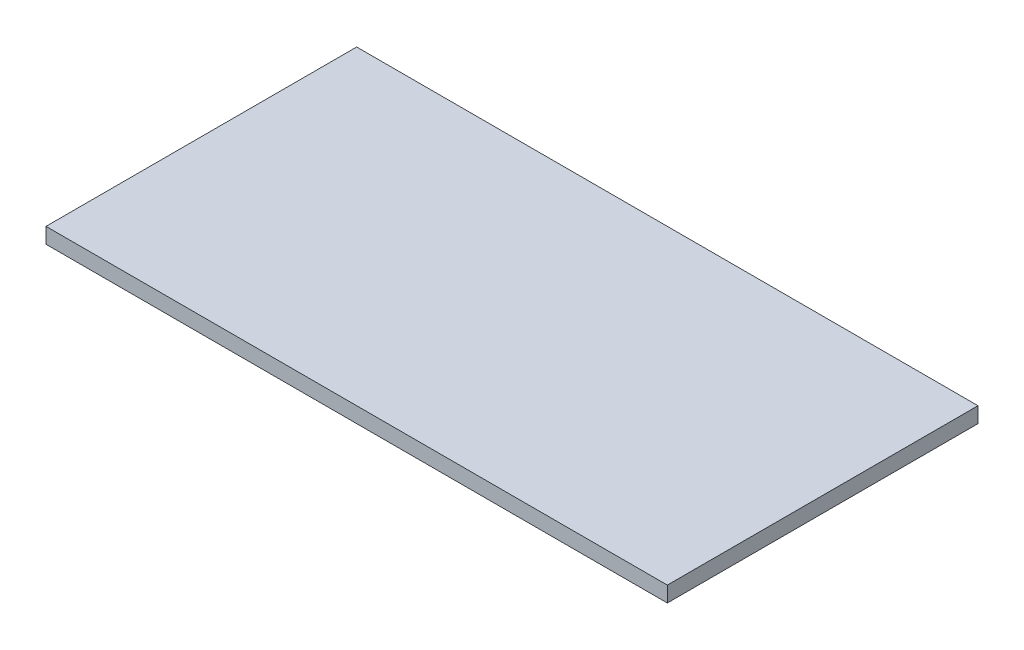
ISO-10303-21;
HEADER;
FILE_DESCRIPTION(('STEP AP214'),'2;1');
FILE_NAME('part.step','',(''),(''),'','','');
FILE_SCHEMA(('AUTOMOTIVE_DESIGN { 1 0 10303 214 1 1 1 1 }'));
ENDSEC;
DATA;
#1=APPLICATION_CONTEXT('core data for automotive mechanical design processes');
#2=APPLICATION_PROTOCOL_DEFINITION('international standard','automotive_design',2000,#1);
#3=PRODUCT_CONTEXT('',#1,'mechanical');
#4=PRODUCT('Part','Part','',(#3));
#5=PRODUCT_RELATED_PRODUCT_CATEGORY('part','',(#4));
#6=PRODUCT_DEFINITION_FORMATION('','',#4);
#7=PRODUCT_DEFINITION_CONTEXT('part definition',#1,'design');
#8=PRODUCT_DEFINITION('design','',#6,#7);
#9=PRODUCT_DEFINITION_SHAPE('','',#8);
#10=(LENGTH_UNIT() NAMED_UNIT(*) SI_UNIT(.MILLI.,.METRE.));
#11=(NAMED_UNIT(*) PLANE_ANGLE_UNIT() SI_UNIT($,.RADIAN.));
#12=(NAMED_UNIT(*) SI_UNIT($,.STERADIAN.) SOLID_ANGLE_UNIT());
#13=UNCERTAINTY_MEASURE_WITH_UNIT(LENGTH_MEASURE(1.E-05),#10,'distance_accuracy_value','');
#14=(GEOMETRIC_REPRESENTATION_CONTEXT(3) GLOBAL_UNCERTAINTY_ASSIGNED_CONTEXT((#13)) GLOBAL_UNIT_ASSIGNED_CONTEXT((#10,
#11,#12)) REPRESENTATION_CONTEXT('',''));
#15=CARTESIAN_POINT('',(0.,0.,0.));
#16=DIRECTION('',(0.,0.,1.));
#17=DIRECTION('',(1.,0.,0.));
#18=AXIS2_PLACEMENT_3D('',#15,#16,#17);
#19=CARTESIAN_POINT('',(0.,25.4,0.));
#20=DIRECTION('',(1.,0.,0.));
#21=DIRECTION('',(0.,0.,-1.));
#22=AXIS2_PLACEMENT_3D('',#19,#20,#21);
#23=PLANE('',#22);
#24=DIRECTION('',(0.,0.,1.));
#25=VECTOR('',#24,1.);
#26=CARTESIAN_POINT('',(0.,0.,0.));
#27=LINE('',#26,#25);
#28=CARTESIAN_POINT('',(0.,0.,-508.));
#29=VERTEX_POINT('',#28);
#30=CARTESIAN_POINT('',(0.,0.,0.));
#31=VERTEX_POINT('',#30);
#32=EDGE_CURVE('E99',#29,#31,#27,.T.);
#33=ORIENTED_EDGE('',*,*,#32,.T.);
#34=DIRECTION('',(0.,-1.,0.));
#35=VECTOR('',#34,1.);
#36=CARTESIAN_POINT('',(0.,25.4,0.));
#37=LINE('',#36,#35);
#38=CARTESIAN_POINT('',(0.,25.4,0.));
#39=VERTEX_POINT('',#38);
#40=EDGE_CURVE('E11',#39,#31,#37,.T.);
#41=ORIENTED_EDGE('',*,*,#40,.F.);
#42=DIRECTION('',(0.,0.,1.));
#43=VECTOR('',#42,1.);
#44=CARTESIAN_POINT('',(0.,25.4,0.));
#45=LINE('',#44,#43);
#46=CARTESIAN_POINT('',(0.,25.4,-508.));
#47=VERTEX_POINT('',#46);
#48=EDGE_CURVE('E87',#47,#39,#45,.T.);
#49=ORIENTED_EDGE('',*,*,#48,.F.);
#50=DIRECTION('',(0.,-1.,0.));
#51=VECTOR('',#50,1.);
#52=CARTESIAN_POINT('',(0.,25.4,-508.));
#53=LINE('',#52,#51);
#54=EDGE_CURVE('E95',#47,#29,#53,.T.);
#55=ORIENTED_EDGE('',*,*,#54,.T.);
#56=EDGE_LOOP('',(#33,#41,#49,#55));
#57=FACE_BOUND('',#56,.T.);
#58=ADVANCED_FACE('F36',(#57),#23,.F.);
#59=CARTESIAN_POINT('',(0.,25.4,0.));
#60=DIRECTION('',(0.,0.,-1.));
#61=DIRECTION('',(-1.,0.,0.));
#62=AXIS2_PLACEMENT_3D('',#59,#60,#61);
#63=PLANE('',#62);
#64=DIRECTION('',(1.,0.,0.));
#65=VECTOR('',#64,1.);
#66=CARTESIAN_POINT('',(0.,0.,0.));
#67=LINE('',#66,#65);
#68=CARTESIAN_POINT('',(1016.,0.,0.));
#69=VERTEX_POINT('',#68);
#70=EDGE_CURVE('E91',#31,#69,#67,.T.);
#71=ORIENTED_EDGE('',*,*,#70,.T.);
#72=DIRECTION('',(0.,-1.,0.));
#73=VECTOR('',#72,1.);
#74=CARTESIAN_POINT('',(1016.,25.4,0.));
#75=LINE('',#74,#73);
#76=CARTESIAN_POINT('',(1016.,25.4,0.));
#77=VERTEX_POINT('',#76);
#78=EDGE_CURVE('E44',#77,#69,#75,.T.);
#79=ORIENTED_EDGE('',*,*,#78,.F.);
#80=DIRECTION('',(1.,0.,0.));
#81=VECTOR('',#80,1.);
#82=CARTESIAN_POINT('',(0.,25.4,0.));
#83=LINE('',#82,#81);
#84=EDGE_CURVE('E82',#39,#77,#83,.T.);
#85=ORIENTED_EDGE('',*,*,#84,.F.);
#86=ORIENTED_EDGE('',*,*,#40,.T.);
#87=EDGE_LOOP('',(#71,#79,#85,#86));
#88=FACE_BOUND('',#87,.T.);
#89=ADVANCED_FACE('F90',(#88),#63,.F.);
#90=CARTESIAN_POINT('',(1016.,25.4,0.));
#91=DIRECTION('',(-1.,0.,0.));
#92=DIRECTION('',(0.,0.,1.));
#93=AXIS2_PLACEMENT_3D('',#90,#91,#92);
#94=PLANE('',#93);
#95=DIRECTION('',(0.,0.,-1.));
#96=VECTOR('',#95,1.);
#97=CARTESIAN_POINT('',(1016.,0.,0.));
#98=LINE('',#97,#96);
#99=CARTESIAN_POINT('',(1016.,0.,-508.));
#100=VERTEX_POINT('',#99);
#101=EDGE_CURVE('E69',#69,#100,#98,.T.);
#102=ORIENTED_EDGE('',*,*,#101,.T.);
#103=DIRECTION('',(0.,-1.,0.));
#104=VECTOR('',#103,1.);
#105=CARTESIAN_POINT('',(1016.,25.4,-508.));
#106=LINE('',#105,#104);
#107=CARTESIAN_POINT('',(1016.,25.4,-508.));
#108=VERTEX_POINT('',#107);
#109=EDGE_CURVE('E92',#108,#100,#106,.T.);
#110=ORIENTED_EDGE('',*,*,#109,.F.);
#111=DIRECTION('',(0.,0.,-1.));
#112=VECTOR('',#111,1.);
#113=CARTESIAN_POINT('',(1016.,25.4,0.));
#114=LINE('',#113,#112);
#115=EDGE_CURVE('E85',#77,#108,#114,.T.);
#116=ORIENTED_EDGE('',*,*,#115,.F.);
#117=ORIENTED_EDGE('',*,*,#78,.T.);
#118=EDGE_LOOP('',(#102,#110,#116,#117));
#119=FACE_BOUND('',#118,.T.);
#120=ADVANCED_FACE('F93',(#119),#94,.F.);
#121=CARTESIAN_POINT('',(0.,25.4,-508.));
#122=DIRECTION('',(0.,0.,1.));
#123=DIRECTION('',(1.,0.,0.));
#124=AXIS2_PLACEMENT_3D('',#121,#122,#123);
#125=PLANE('',#124);
#126=DIRECTION('',(-1.,0.,0.));
#127=VECTOR('',#126,1.);
#128=CARTESIAN_POINT('',(0.,0.,-508.));
#129=LINE('',#128,#127);
#130=EDGE_CURVE('E75',#100,#29,#129,.T.);
#131=ORIENTED_EDGE('',*,*,#130,.T.);
#132=ORIENTED_EDGE('',*,*,#54,.F.);
#133=DIRECTION('',(-1.,0.,0.));
#134=VECTOR('',#133,1.);
#135=CARTESIAN_POINT('',(0.,25.4,-508.));
#136=LINE('',#135,#134);
#137=EDGE_CURVE('E52',#108,#47,#136,.T.);
#138=ORIENTED_EDGE('',*,*,#137,.F.);
#139=ORIENTED_EDGE('',*,*,#109,.T.);
#140=EDGE_LOOP('',(#131,#132,#138,#139));
#141=FACE_BOUND('',#140,.T.);
#142=ADVANCED_FACE('F106',(#141),#125,.F.);
#143=CARTESIAN_POINT('',(0.,25.4,0.));
#144=DIRECTION('',(0.,-1.,0.));
#145=DIRECTION('',(0.,0.,-1.));
#146=AXIS2_PLACEMENT_3D('',#143,#144,#145);
#147=PLANE('',#146);
#148=ORIENTED_EDGE('',*,*,#48,.T.);
#149=ORIENTED_EDGE('',*,*,#84,.T.);
#150=ORIENTED_EDGE('',*,*,#115,.T.);
#151=ORIENTED_EDGE('',*,*,#137,.T.);
#152=EDGE_LOOP('',(#148,#149,#150,#151));
#153=FACE_BOUND('',#152,.T.);
#154=ADVANCED_FACE('F83',(#153),#147,.F.);
#155=CARTESIAN_POINT('',(0.,0.,0.));
#156=DIRECTION('',(0.,-1.,0.));
#157=DIRECTION('',(0.,0.,-1.));
#158=AXIS2_PLACEMENT_3D('',#155,#156,#157);
#159=PLANE('',#158);
#160=ORIENTED_EDGE('',*,*,#32,.F.);
#161=ORIENTED_EDGE('',*,*,#130,.F.);
#162=ORIENTED_EDGE('',*,*,#101,.F.);
#163=ORIENTED_EDGE('',*,*,#70,.F.);
#164=EDGE_LOOP('',(#160,#161,#162,#163));
#165=FACE_BOUND('',#164,.T.);
#166=ADVANCED_FACE('F109',(#165),#159,.T.);
#167=CLOSED_SHELL('',(#58,#89,#120,#142,#154,#166));
#168=MANIFOLD_SOLID_BREP('B2',#167);
#169=ADVANCED_BREP_SHAPE_REPRESENTATION('',(#18,#168),#14);
#170=SHAPE_DEFINITION_REPRESENTATION(#9,#169);
ENDSEC;
END-ISO-10303-21;
